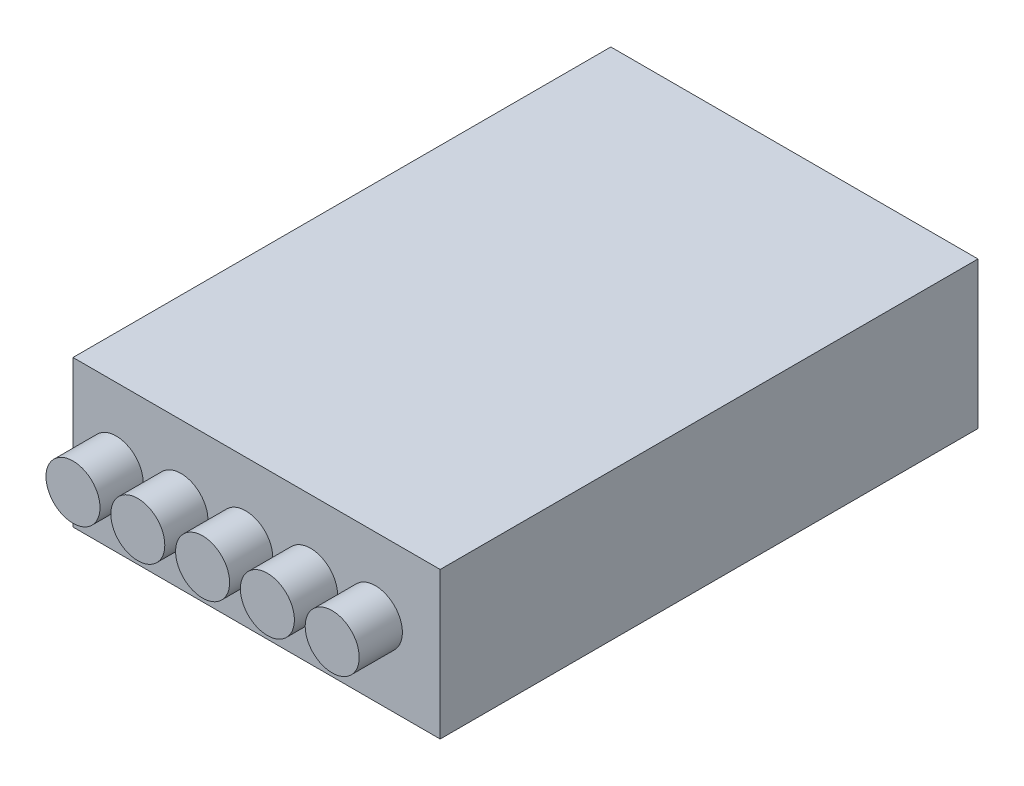
ISO-10303-21;
HEADER;
FILE_DESCRIPTION(('STEP AP214'),'2;1');
FILE_NAME('part.step','',(''),(''),'','','');
FILE_SCHEMA(('AUTOMOTIVE_DESIGN { 1 0 10303 214 1 1 1 1 }'));
ENDSEC;
DATA;
#1=APPLICATION_CONTEXT('core data for automotive mechanical design processes');
#2=APPLICATION_PROTOCOL_DEFINITION('international standard','automotive_design',2000,#1);
#3=PRODUCT_CONTEXT('',#1,'mechanical');
#4=PRODUCT('Part','Part','',(#3));
#5=PRODUCT_RELATED_PRODUCT_CATEGORY('part','',(#4));
#6=PRODUCT_DEFINITION_FORMATION('','',#4);
#7=PRODUCT_DEFINITION_CONTEXT('part definition',#1,'design');
#8=PRODUCT_DEFINITION('design','',#6,#7);
#9=PRODUCT_DEFINITION_SHAPE('','',#8);
#10=(LENGTH_UNIT() NAMED_UNIT(*) SI_UNIT(.MILLI.,.METRE.));
#11=(NAMED_UNIT(*) PLANE_ANGLE_UNIT() SI_UNIT($,.RADIAN.));
#12=(NAMED_UNIT(*) SI_UNIT($,.STERADIAN.) SOLID_ANGLE_UNIT());
#13=UNCERTAINTY_MEASURE_WITH_UNIT(LENGTH_MEASURE(1.E-05),#10,'distance_accuracy_value','');
#14=(GEOMETRIC_REPRESENTATION_CONTEXT(3) GLOBAL_UNCERTAINTY_ASSIGNED_CONTEXT((#13)) GLOBAL_UNIT_ASSIGNED_CONTEXT((#10,
#11,#12)) REPRESENTATION_CONTEXT('',''));
#15=CARTESIAN_POINT('',(0.,0.,0.));
#16=DIRECTION('',(0.,0.,1.));
#17=DIRECTION('',(1.,0.,0.));
#18=AXIS2_PLACEMENT_3D('',#15,#16,#17);
#19=CARTESIAN_POINT('',(85.,68.,-124.5));
#20=DIRECTION('',(-1.,0.,0.));
#21=DIRECTION('',(0.,0.,1.));
#22=AXIS2_PLACEMENT_3D('',#19,#20,#21);
#23=PLANE('',#22);
#24=DIRECTION('',(0.,0.,-1.));
#25=VECTOR('',#24,1.);
#26=CARTESIAN_POINT('',(85.,0.,-124.5));
#27=LINE('',#26,#25);
#28=CARTESIAN_POINT('',(85.,0.,124.5));
#29=VERTEX_POINT('',#28);
#30=CARTESIAN_POINT('',(85.,0.,-124.5));
#31=VERTEX_POINT('',#30);
#32=EDGE_CURVE('E124',#29,#31,#27,.T.);
#33=ORIENTED_EDGE('',*,*,#32,.T.);
#34=DIRECTION('',(0.,-1.,0.));
#35=VECTOR('',#34,1.);
#36=CARTESIAN_POINT('',(85.,68.,-124.5));
#37=LINE('',#36,#35);
#38=CARTESIAN_POINT('',(85.,68.,-124.5));
#39=VERTEX_POINT('',#38);
#40=EDGE_CURVE('E113',#39,#31,#37,.T.);
#41=ORIENTED_EDGE('',*,*,#40,.F.);
#42=DIRECTION('',(0.,0.,-1.));
#43=VECTOR('',#42,1.);
#44=CARTESIAN_POINT('',(85.,68.,-124.5));
#45=LINE('',#44,#43);
#46=CARTESIAN_POINT('',(85.,68.,124.5));
#47=VERTEX_POINT('',#46);
#48=EDGE_CURVE('E105',#47,#39,#45,.T.);
#49=ORIENTED_EDGE('',*,*,#48,.F.);
#50=DIRECTION('',(0.,-1.,0.));
#51=VECTOR('',#50,1.);
#52=CARTESIAN_POINT('',(85.,68.,124.5));
#53=LINE('',#52,#51);
#54=EDGE_CURVE('E120',#47,#29,#53,.T.);
#55=ORIENTED_EDGE('',*,*,#54,.T.);
#56=EDGE_LOOP('',(#33,#41,#49,#55));
#57=FACE_BOUND('',#56,.T.);
#58=ADVANCED_FACE('F51',(#57),#23,.F.);
#59=CARTESIAN_POINT('',(-85.,68.,-124.5));
#60=DIRECTION('',(0.,0.,1.));
#61=DIRECTION('',(1.,0.,0.));
#62=AXIS2_PLACEMENT_3D('',#59,#60,#61);
#63=PLANE('',#62);
#64=DIRECTION('',(-1.,0.,0.));
#65=VECTOR('',#64,1.);
#66=CARTESIAN_POINT('',(-85.,0.,-124.5));
#67=LINE('',#66,#65);
#68=CARTESIAN_POINT('',(-85.,0.,-124.5));
#69=VERTEX_POINT('',#68);
#70=EDGE_CURVE('E111',#31,#69,#67,.T.);
#71=ORIENTED_EDGE('',*,*,#70,.T.);
#72=DIRECTION('',(0.,-1.,0.));
#73=VECTOR('',#72,1.);
#74=CARTESIAN_POINT('',(-85.,68.,-124.5));
#75=LINE('',#74,#73);
#76=CARTESIAN_POINT('',(-85.,68.,-124.5));
#77=VERTEX_POINT('',#76);
#78=EDGE_CURVE('E109',#77,#69,#75,.T.);
#79=ORIENTED_EDGE('',*,*,#78,.F.);
#80=DIRECTION('',(-1.,0.,0.));
#81=VECTOR('',#80,1.);
#82=CARTESIAN_POINT('',(-85.,68.,-124.5));
#83=LINE('',#82,#81);
#84=EDGE_CURVE('E100',#39,#77,#83,.T.);
#85=ORIENTED_EDGE('',*,*,#84,.F.);
#86=ORIENTED_EDGE('',*,*,#40,.T.);
#87=EDGE_LOOP('',(#71,#79,#85,#86));
#88=FACE_BOUND('',#87,.T.);
#89=ADVANCED_FACE('F110',(#88),#63,.F.);
#90=CARTESIAN_POINT('',(-85.,68.,-124.5));
#91=DIRECTION('',(1.,0.,0.));
#92=DIRECTION('',(0.,0.,-1.));
#93=AXIS2_PLACEMENT_3D('',#90,#91,#92);
#94=PLANE('',#93);
#95=DIRECTION('',(0.,0.,1.));
#96=VECTOR('',#95,1.);
#97=CARTESIAN_POINT('',(-85.,0.,-124.5));
#98=LINE('',#97,#96);
#99=CARTESIAN_POINT('',(-85.,0.,124.5));
#100=VERTEX_POINT('',#99);
#101=EDGE_CURVE('E86',#69,#100,#98,.T.);
#102=ORIENTED_EDGE('',*,*,#101,.T.);
#103=DIRECTION('',(0.,-1.,0.));
#104=VECTOR('',#103,1.);
#105=CARTESIAN_POINT('',(-85.,68.,124.5));
#106=LINE('',#105,#104);
#107=CARTESIAN_POINT('',(-85.,68.,124.5));
#108=VERTEX_POINT('',#107);
#109=EDGE_CURVE('E114',#108,#100,#106,.T.);
#110=ORIENTED_EDGE('',*,*,#109,.F.);
#111=DIRECTION('',(0.,0.,1.));
#112=VECTOR('',#111,1.);
#113=CARTESIAN_POINT('',(-85.,68.,-124.5));
#114=LINE('',#113,#112);
#115=EDGE_CURVE('E103',#77,#108,#114,.T.);
#116=ORIENTED_EDGE('',*,*,#115,.F.);
#117=ORIENTED_EDGE('',*,*,#78,.T.);
#118=EDGE_LOOP('',(#102,#110,#116,#117));
#119=FACE_BOUND('',#118,.T.);
#120=ADVANCED_FACE('F116',(#119),#94,.F.);
#121=CARTESIAN_POINT('',(-85.,68.,124.5));
#122=DIRECTION('',(0.,0.,-1.));
#123=DIRECTION('',(-1.,0.,0.));
#124=AXIS2_PLACEMENT_3D('',#121,#122,#123);
#125=PLANE('',#124);
#126=CARTESIAN_POINT('',(-4.99999999999998,34.,124.5));
#127=DIRECTION('',(0.,0.,1.));
#128=DIRECTION('',(1.,0.,0.));
#129=AXIS2_PLACEMENT_3D('',#126,#127,#128);
#130=CIRCLE('',#129,12.5);
#131=CARTESIAN_POINT('',(7.50000000000002,34.,124.5));
#132=VERTEX_POINT('',#131);
#133=EDGE_CURVE('E11',#132,#132,#130,.T.);
#134=ORIENTED_EDGE('',*,*,#133,.F.);
#135=EDGE_LOOP('',(#134));
#136=FACE_BOUND('',#135,.T.);
#137=CARTESIAN_POINT('',(-65.,34.,124.5));
#138=DIRECTION('',(0.,0.,-1.));
#139=DIRECTION('',(-1.,0.,0.));
#140=AXIS2_PLACEMENT_3D('',#137,#138,#139);
#141=CIRCLE('',#140,12.5);
#142=CARTESIAN_POINT('',(-77.5,34.,124.5));
#143=VERTEX_POINT('',#142);
#144=EDGE_CURVE('E54',#143,#143,#141,.F.);
#145=ORIENTED_EDGE('',*,*,#144,.F.);
#146=EDGE_LOOP('',(#145));
#147=FACE_BOUND('',#146,.T.);
#148=CARTESIAN_POINT('',(-35.,34.,124.5));
#149=DIRECTION('',(0.,0.,-1.));
#150=DIRECTION('',(-1.,0.,0.));
#151=AXIS2_PLACEMENT_3D('',#148,#149,#150);
#152=CIRCLE('',#151,12.5);
#153=CARTESIAN_POINT('',(-47.5,34.,124.5));
#154=VERTEX_POINT('',#153);
#155=EDGE_CURVE('E148',#154,#154,#152,.F.);
#156=ORIENTED_EDGE('',*,*,#155,.F.);
#157=EDGE_LOOP('',(#156));
#158=FACE_BOUND('',#157,.T.);
#159=CARTESIAN_POINT('',(25.,34.,124.5));
#160=DIRECTION('',(0.,0.,-1.));
#161=DIRECTION('',(-1.,0.,0.));
#162=AXIS2_PLACEMENT_3D('',#159,#160,#161);
#163=CIRCLE('',#162,12.5);
#164=CARTESIAN_POINT('',(12.5,34.,124.5));
#165=VERTEX_POINT('',#164);
#166=EDGE_CURVE('E145',#165,#165,#163,.F.);
#167=ORIENTED_EDGE('',*,*,#166,.F.);
#168=EDGE_LOOP('',(#167));
#169=FACE_BOUND('',#168,.T.);
#170=CARTESIAN_POINT('',(55.,34.,124.5));
#171=DIRECTION('',(0.,0.,-1.));
#172=DIRECTION('',(-1.,0.,0.));
#173=AXIS2_PLACEMENT_3D('',#170,#171,#172);
#174=CIRCLE('',#173,12.5);
#175=CARTESIAN_POINT('',(42.5,34.,124.5));
#176=VERTEX_POINT('',#175);
#177=EDGE_CURVE('E141',#176,#176,#174,.F.);
#178=ORIENTED_EDGE('',*,*,#177,.F.);
#179=EDGE_LOOP('',(#178));
#180=FACE_BOUND('',#179,.T.);
#181=DIRECTION('',(1.,0.,0.));
#182=VECTOR('',#181,1.);
#183=CARTESIAN_POINT('',(-85.,0.,124.5));
#184=LINE('',#183,#182);
#185=EDGE_CURVE('E92',#100,#29,#184,.T.);
#186=ORIENTED_EDGE('',*,*,#185,.T.);
#187=ORIENTED_EDGE('',*,*,#54,.F.);
#188=DIRECTION('',(1.,0.,0.));
#189=VECTOR('',#188,1.);
#190=CARTESIAN_POINT('',(-85.,68.,124.5));
#191=LINE('',#190,#189);
#192=EDGE_CURVE('E69',#108,#47,#191,.T.);
#193=ORIENTED_EDGE('',*,*,#192,.F.);
#194=ORIENTED_EDGE('',*,*,#109,.T.);
#195=EDGE_LOOP('',(#186,#187,#193,#194));
#196=FACE_BOUND('',#195,.T.);
#197=ADVANCED_FACE('F159',(#136,#147,#158,#169,#180,#196),#125,.F.);
#198=CARTESIAN_POINT('',(0.,68.,0.));
#199=DIRECTION('',(0.,1.,0.));
#200=DIRECTION('',(0.,0.,1.));
#201=AXIS2_PLACEMENT_3D('',#198,#199,#200);
#202=PLANE('',#201);
#203=ORIENTED_EDGE('',*,*,#48,.T.);
#204=ORIENTED_EDGE('',*,*,#84,.T.);
#205=ORIENTED_EDGE('',*,*,#115,.T.);
#206=ORIENTED_EDGE('',*,*,#192,.T.);
#207=EDGE_LOOP('',(#203,#204,#205,#206));
#208=FACE_BOUND('',#207,.T.);
#209=ADVANCED_FACE('F101',(#208),#202,.T.);
#210=CARTESIAN_POINT('',(0.,0.,0.));
#211=DIRECTION('',(0.,1.,0.));
#212=DIRECTION('',(0.,0.,1.));
#213=AXIS2_PLACEMENT_3D('',#210,#211,#212);
#214=PLANE('',#213);
#215=ORIENTED_EDGE('',*,*,#32,.F.);
#216=ORIENTED_EDGE('',*,*,#185,.F.);
#217=ORIENTED_EDGE('',*,*,#101,.F.);
#218=ORIENTED_EDGE('',*,*,#70,.F.);
#219=EDGE_LOOP('',(#215,#216,#217,#218));
#220=FACE_BOUND('',#219,.T.);
#221=ADVANCED_FACE('F172',(#220),#214,.F.);
#222=CARTESIAN_POINT('',(55.,34.,144.5));
#223=DIRECTION('',(0.,0.,-1.));
#224=DIRECTION('',(-1.,0.,0.));
#225=AXIS2_PLACEMENT_3D('',#222,#223,#224);
#226=CYLINDRICAL_SURFACE('',#225,12.5);
#227=CARTESIAN_POINT('',(55.,34.,144.5));
#228=DIRECTION('',(0.,0.,1.));
#229=DIRECTION('',(1.,0.,0.));
#230=AXIS2_PLACEMENT_3D('',#227,#228,#229);
#231=CIRCLE('',#230,12.5);
#232=CARTESIAN_POINT('',(67.5,34.,144.5));
#233=VERTEX_POINT('',#232);
#234=EDGE_CURVE('E194',#233,#233,#231,.T.);
#235=ORIENTED_EDGE('',*,*,#234,.F.);
#236=EDGE_LOOP('',(#235));
#237=FACE_BOUND('',#236,.T.);
#238=ORIENTED_EDGE('',*,*,#177,.T.);
#239=EDGE_LOOP('',(#238));
#240=FACE_BOUND('',#239,.T.);
#241=ADVANCED_FACE('F169',(#237,#240),#226,.T.);
#242=CARTESIAN_POINT('',(55.,34.,144.5));
#243=DIRECTION('',(0.,0.,1.));
#244=DIRECTION('',(1.,0.,0.));
#245=AXIS2_PLACEMENT_3D('',#242,#243,#244);
#246=PLANE('',#245);
#247=ORIENTED_EDGE('',*,*,#234,.T.);
#248=EDGE_LOOP('',(#247));
#249=FACE_BOUND('',#248,.T.);
#250=ADVANCED_FACE('F171',(#249),#246,.T.);
#251=CARTESIAN_POINT('',(25.,34.,144.5));
#252=DIRECTION('',(0.,0.,-1.));
#253=DIRECTION('',(-1.,0.,0.));
#254=AXIS2_PLACEMENT_3D('',#251,#252,#253);
#255=CYLINDRICAL_SURFACE('',#254,12.5);
#256=CARTESIAN_POINT('',(25.,34.,144.5));
#257=DIRECTION('',(0.,0.,1.));
#258=DIRECTION('',(1.,0.,0.));
#259=AXIS2_PLACEMENT_3D('',#256,#257,#258);
#260=CIRCLE('',#259,12.5);
#261=CARTESIAN_POINT('',(37.5,34.,144.5));
#262=VERTEX_POINT('',#261);
#263=EDGE_CURVE('E198',#262,#262,#260,.T.);
#264=ORIENTED_EDGE('',*,*,#263,.F.);
#265=EDGE_LOOP('',(#264));
#266=FACE_BOUND('',#265,.T.);
#267=ORIENTED_EDGE('',*,*,#166,.T.);
#268=EDGE_LOOP('',(#267));
#269=FACE_BOUND('',#268,.T.);
#270=ADVANCED_FACE('F178',(#266,#269),#255,.T.);
#271=CARTESIAN_POINT('',(25.,34.,144.5));
#272=DIRECTION('',(0.,0.,1.));
#273=DIRECTION('',(1.,0.,0.));
#274=AXIS2_PLACEMENT_3D('',#271,#272,#273);
#275=PLANE('',#274);
#276=ORIENTED_EDGE('',*,*,#263,.T.);
#277=EDGE_LOOP('',(#276));
#278=FACE_BOUND('',#277,.T.);
#279=ADVANCED_FACE('F230',(#278),#275,.T.);
#280=CARTESIAN_POINT('',(-35.,34.,144.5));
#281=DIRECTION('',(0.,0.,-1.));
#282=DIRECTION('',(-1.,0.,0.));
#283=AXIS2_PLACEMENT_3D('',#280,#281,#282);
#284=CYLINDRICAL_SURFACE('',#283,12.5);
#285=CARTESIAN_POINT('',(-35.,34.,144.5));
#286=DIRECTION('',(0.,0.,1.));
#287=DIRECTION('',(1.,0.,0.));
#288=AXIS2_PLACEMENT_3D('',#285,#286,#287);
#289=CIRCLE('',#288,12.5);
#290=CARTESIAN_POINT('',(-22.5,34.,144.5));
#291=VERTEX_POINT('',#290);
#292=EDGE_CURVE('E205',#291,#291,#289,.T.);
#293=ORIENTED_EDGE('',*,*,#292,.F.);
#294=EDGE_LOOP('',(#293));
#295=FACE_BOUND('',#294,.T.);
#296=ORIENTED_EDGE('',*,*,#155,.T.);
#297=EDGE_LOOP('',(#296));
#298=FACE_BOUND('',#297,.T.);
#299=ADVANCED_FACE('F225',(#295,#298),#284,.T.);
#300=CARTESIAN_POINT('',(-35.,34.,144.5));
#301=DIRECTION('',(0.,0.,1.));
#302=DIRECTION('',(1.,0.,0.));
#303=AXIS2_PLACEMENT_3D('',#300,#301,#302);
#304=PLANE('',#303);
#305=ORIENTED_EDGE('',*,*,#292,.T.);
#306=EDGE_LOOP('',(#305));
#307=FACE_BOUND('',#306,.T.);
#308=ADVANCED_FACE('F217',(#307),#304,.T.);
#309=CARTESIAN_POINT('',(-65.,34.,144.5));
#310=DIRECTION('',(0.,0.,-1.));
#311=DIRECTION('',(-1.,0.,0.));
#312=AXIS2_PLACEMENT_3D('',#309,#310,#311);
#313=CYLINDRICAL_SURFACE('',#312,12.5);
#314=CARTESIAN_POINT('',(-65.,34.,144.5));
#315=DIRECTION('',(0.,0.,1.));
#316=DIRECTION('',(1.,0.,0.));
#317=AXIS2_PLACEMENT_3D('',#314,#315,#316);
#318=CIRCLE('',#317,12.5);
#319=CARTESIAN_POINT('',(-52.5,34.,144.5));
#320=VERTEX_POINT('',#319);
#321=EDGE_CURVE('E128',#320,#320,#318,.T.);
#322=ORIENTED_EDGE('',*,*,#321,.F.);
#323=EDGE_LOOP('',(#322));
#324=FACE_BOUND('',#323,.T.);
#325=ORIENTED_EDGE('',*,*,#144,.T.);
#326=EDGE_LOOP('',(#325));
#327=FACE_BOUND('',#326,.T.);
#328=ADVANCED_FACE('F157',(#324,#327),#313,.T.);
#329=CARTESIAN_POINT('',(-65.,34.,144.5));
#330=DIRECTION('',(0.,0.,1.));
#331=DIRECTION('',(1.,0.,0.));
#332=AXIS2_PLACEMENT_3D('',#329,#330,#331);
#333=PLANE('',#332);
#334=ORIENTED_EDGE('',*,*,#321,.T.);
#335=EDGE_LOOP('',(#334));
#336=FACE_BOUND('',#335,.T.);
#337=ADVANCED_FACE('F214',(#336),#333,.T.);
#338=CARTESIAN_POINT('',(-4.99999999999998,34.,144.5));
#339=DIRECTION('',(0.,0.,-1.));
#340=DIRECTION('',(-1.,0.,0.));
#341=AXIS2_PLACEMENT_3D('',#338,#339,#340);
#342=CYLINDRICAL_SURFACE('',#341,12.5);
#343=CARTESIAN_POINT('',(-4.99999999999998,34.,144.5));
#344=DIRECTION('',(0.,0.,1.));
#345=DIRECTION('',(1.,0.,0.));
#346=AXIS2_PLACEMENT_3D('',#343,#344,#345);
#347=CIRCLE('',#346,12.5);
#348=CARTESIAN_POINT('',(7.50000000000002,34.,144.5));
#349=VERTEX_POINT('',#348);
#350=EDGE_CURVE('E202',#349,#349,#347,.T.);
#351=ORIENTED_EDGE('',*,*,#350,.F.);
#352=EDGE_LOOP('',(#351));
#353=FACE_BOUND('',#352,.T.);
#354=ORIENTED_EDGE('',*,*,#133,.T.);
#355=EDGE_LOOP('',(#354));
#356=FACE_BOUND('',#355,.T.);
#357=ADVANCED_FACE('F223',(#353,#356),#342,.T.);
#358=CARTESIAN_POINT('',(-4.99999999999998,34.,144.5));
#359=DIRECTION('',(0.,0.,1.));
#360=DIRECTION('',(1.,0.,0.));
#361=AXIS2_PLACEMENT_3D('',#358,#359,#360);
#362=PLANE('',#361);
#363=ORIENTED_EDGE('',*,*,#350,.T.);
#364=EDGE_LOOP('',(#363));
#365=FACE_BOUND('',#364,.T.);
#366=ADVANCED_FACE('F235',(#365),#362,.T.);
#367=CLOSED_SHELL('',(#58,#89,#120,#197,#209,#221,#241,#250,#270,#279,#299,#308,#328,#337,#357,#366));
#368=MANIFOLD_SOLID_BREP('B2',#367);
#369=ADVANCED_BREP_SHAPE_REPRESENTATION('',(#18,#368),#14);
#370=SHAPE_DEFINITION_REPRESENTATION(#9,#369);
ENDSEC;
END-ISO-10303-21;
